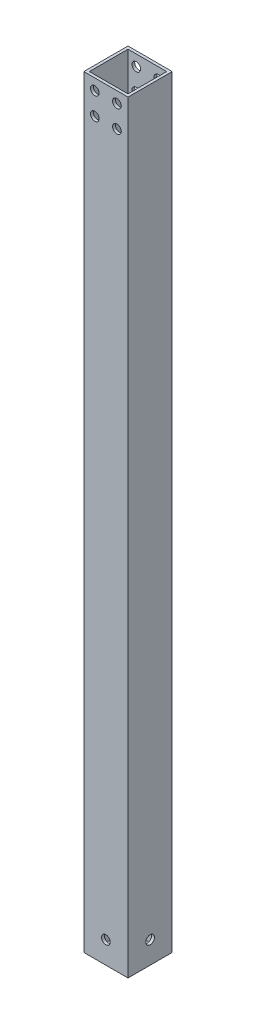
ISO-10303-21;
HEADER;
FILE_DESCRIPTION(('STEP AP214'),'2;1');
FILE_NAME('part.step','',(''),(''),'','','');
FILE_SCHEMA(('AUTOMOTIVE_DESIGN { 1 0 10303 214 1 1 1 1 }'));
ENDSEC;
DATA;
#1=APPLICATION_CONTEXT('core data for automotive mechanical design processes');
#2=APPLICATION_PROTOCOL_DEFINITION('international standard','automotive_design',2000,#1);
#3=PRODUCT_CONTEXT('',#1,'mechanical');
#4=PRODUCT('Part','Part','',(#3));
#5=PRODUCT_RELATED_PRODUCT_CATEGORY('part','',(#4));
#6=PRODUCT_DEFINITION_FORMATION('','',#4);
#7=PRODUCT_DEFINITION_CONTEXT('part definition',#1,'design');
#8=PRODUCT_DEFINITION('design','',#6,#7);
#9=PRODUCT_DEFINITION_SHAPE('','',#8);
#10=(LENGTH_UNIT() NAMED_UNIT(*) SI_UNIT(.MILLI.,.METRE.));
#11=(NAMED_UNIT(*) PLANE_ANGLE_UNIT() SI_UNIT($,.RADIAN.));
#12=(NAMED_UNIT(*) SI_UNIT($,.STERADIAN.) SOLID_ANGLE_UNIT());
#13=UNCERTAINTY_MEASURE_WITH_UNIT(LENGTH_MEASURE(1.E-05),#10,'distance_accuracy_value','');
#14=(GEOMETRIC_REPRESENTATION_CONTEXT(3) GLOBAL_UNCERTAINTY_ASSIGNED_CONTEXT((#13)) GLOBAL_UNIT_ASSIGNED_CONTEXT((#10,
#11,#12)) REPRESENTATION_CONTEXT('',''));
#15=CARTESIAN_POINT('',(0.,0.,0.));
#16=DIRECTION('',(0.,0.,1.));
#17=DIRECTION('',(1.,0.,0.));
#18=AXIS2_PLACEMENT_3D('',#15,#16,#17);
#19=CARTESIAN_POINT('',(12.7,955.562720587149,25.4));
#20=DIRECTION('',(0.,1.,0.));
#21=DIRECTION('',(0.,0.,-1.));
#22=AXIS2_PLACEMENT_3D('',#19,#20,#21);
#23=PLANE('',#22);
#24=DIRECTION('',(-1.,0.,0.));
#25=VECTOR('',#24,1.);
#26=CARTESIAN_POINT('',(12.7,955.562720587149,0.));
#27=LINE('',#26,#25);
#28=CARTESIAN_POINT('',(38.1000000000002,955.562720587149,0.));
#29=VERTEX_POINT('',#28);
#30=CARTESIAN_POINT('',(12.7,955.562720587149,0.));
#31=VERTEX_POINT('',#30);
#32=EDGE_CURVE('E148',#29,#31,#27,.T.);
#33=ORIENTED_EDGE('',*,*,#32,.T.);
#34=DIRECTION('',(0.,0.,-1.));
#35=VECTOR('',#34,1.);
#36=CARTESIAN_POINT('',(12.7,955.562720587149,25.4));
#37=LINE('',#36,#35);
#38=CARTESIAN_POINT('',(12.7,955.562720587149,25.4));
#39=VERTEX_POINT('',#38);
#40=EDGE_CURVE('E11',#39,#31,#37,.T.);
#41=ORIENTED_EDGE('',*,*,#40,.F.);
#42=DIRECTION('',(-1.,0.,0.));
#43=VECTOR('',#42,1.);
#44=CARTESIAN_POINT('',(12.7,955.562720587149,25.4));
#45=LINE('',#44,#43);
#46=CARTESIAN_POINT('',(38.1000000000002,955.562720587149,25.4));
#47=VERTEX_POINT('',#46);
#48=EDGE_CURVE('E153',#47,#39,#45,.T.);
#49=ORIENTED_EDGE('',*,*,#48,.F.);
#50=DIRECTION('',(0.,0.,-1.));
#51=VECTOR('',#50,1.);
#52=CARTESIAN_POINT('',(38.1000000000002,955.562720587149,25.4));
#53=LINE('',#52,#51);
#54=EDGE_CURVE('E48',#47,#29,#53,.T.);
#55=ORIENTED_EDGE('',*,*,#54,.T.);
#56=EDGE_LOOP('',(#33,#41,#49,#55));
#57=FACE_BOUND('',#56,.T.);
#58=DIRECTION('',(0.,0.,-1.));
#59=VECTOR('',#58,1.);
#60=CARTESIAN_POINT('',(36.5125000000002,955.562720587149,25.4));
#61=LINE('',#60,#59);
#62=CARTESIAN_POINT('',(36.5125000000002,955.562720587149,23.8125));
#63=VERTEX_POINT('',#62);
#64=CARTESIAN_POINT('',(36.5125000000002,955.562720587149,1.5875));
#65=VERTEX_POINT('',#64);
#66=EDGE_CURVE('E128',#63,#65,#61,.T.);
#67=ORIENTED_EDGE('',*,*,#66,.F.);
#68=DIRECTION('',(-1.,0.,0.));
#69=VECTOR('',#68,1.);
#70=CARTESIAN_POINT('',(0.,955.562720587149,23.8125));
#71=LINE('',#70,#69);
#72=CARTESIAN_POINT('',(14.2875,955.562720587149,23.8125));
#73=VERTEX_POINT('',#72);
#74=EDGE_CURVE('E126',#63,#73,#71,.T.);
#75=ORIENTED_EDGE('',*,*,#74,.T.);
#76=DIRECTION('',(0.,0.,-1.));
#77=VECTOR('',#76,1.);
#78=CARTESIAN_POINT('',(14.2875,955.562720587149,25.4));
#79=LINE('',#78,#77);
#80=CARTESIAN_POINT('',(14.2875,955.562720587149,1.5875));
#81=VERTEX_POINT('',#80);
#82=EDGE_CURVE('E108',#73,#81,#79,.T.);
#83=ORIENTED_EDGE('',*,*,#82,.T.);
#84=DIRECTION('',(-1.,0.,0.));
#85=VECTOR('',#84,1.);
#86=CARTESIAN_POINT('',(0.,955.562720587149,1.5875));
#87=LINE('',#86,#85);
#88=EDGE_CURVE('E119',#65,#81,#87,.T.);
#89=ORIENTED_EDGE('',*,*,#88,.F.);
#90=EDGE_LOOP('',(#67,#75,#83,#89));
#91=FACE_BOUND('',#90,.T.);
#92=ADVANCED_FACE('F39',(#57,#91),#23,.T.);
#93=CARTESIAN_POINT('',(12.7,517.412720587149,25.4));
#94=DIRECTION('',(0.,-1.,0.));
#95=DIRECTION('',(0.,0.,1.));
#96=AXIS2_PLACEMENT_3D('',#93,#94,#95);
#97=PLANE('',#96);
#98=DIRECTION('',(1.,0.,0.));
#99=VECTOR('',#98,1.);
#100=CARTESIAN_POINT('',(12.7,517.412720587149,0.));
#101=LINE('',#100,#99);
#102=CARTESIAN_POINT('',(12.7,517.412720587149,0.));
#103=VERTEX_POINT('',#102);
#104=CARTESIAN_POINT('',(38.1000000000003,517.412720587149,0.));
#105=VERTEX_POINT('',#104);
#106=EDGE_CURVE('E130',#103,#105,#101,.T.);
#107=ORIENTED_EDGE('',*,*,#106,.T.);
#108=DIRECTION('',(0.,0.,-1.));
#109=VECTOR('',#108,1.);
#110=CARTESIAN_POINT('',(38.1000000000003,517.412720587149,25.4));
#111=LINE('',#110,#109);
#112=CARTESIAN_POINT('',(38.1000000000003,517.412720587149,25.4));
#113=VERTEX_POINT('',#112);
#114=EDGE_CURVE('E165',#113,#105,#111,.T.);
#115=ORIENTED_EDGE('',*,*,#114,.F.);
#116=DIRECTION('',(1.,0.,0.));
#117=VECTOR('',#116,1.);
#118=CARTESIAN_POINT('',(12.7,517.412720587149,25.4));
#119=LINE('',#118,#117);
#120=CARTESIAN_POINT('',(12.7,517.412720587149,25.4));
#121=VERTEX_POINT('',#120);
#122=EDGE_CURVE('E147',#121,#113,#119,.T.);
#123=ORIENTED_EDGE('',*,*,#122,.F.);
#124=DIRECTION('',(0.,0.,-1.));
#125=VECTOR('',#124,1.);
#126=CARTESIAN_POINT('',(12.7,517.412720587149,25.4));
#127=LINE('',#126,#125);
#128=EDGE_CURVE('E155',#121,#103,#127,.T.);
#129=ORIENTED_EDGE('',*,*,#128,.T.);
#130=EDGE_LOOP('',(#107,#115,#123,#129));
#131=FACE_BOUND('',#130,.T.);
#132=DIRECTION('',(0.,0.,-1.));
#133=VECTOR('',#132,1.);
#134=CARTESIAN_POINT('',(14.2875,517.412720587149,25.4));
#135=LINE('',#134,#133);
#136=CARTESIAN_POINT('',(14.2875,517.412720587149,23.8125));
#137=VERTEX_POINT('',#136);
#138=CARTESIAN_POINT('',(14.2875,517.412720587149,1.5875));
#139=VERTEX_POINT('',#138);
#140=EDGE_CURVE('E111',#137,#139,#135,.T.);
#141=ORIENTED_EDGE('',*,*,#140,.F.);
#142=DIRECTION('',(1.,0.,0.));
#143=VECTOR('',#142,1.);
#144=CARTESIAN_POINT('',(0.,517.412720587149,23.8125));
#145=LINE('',#144,#143);
#146=CARTESIAN_POINT('',(36.5125000000003,517.412720587149,23.8125));
#147=VERTEX_POINT('',#146);
#148=EDGE_CURVE('E139',#137,#147,#145,.T.);
#149=ORIENTED_EDGE('',*,*,#148,.T.);
#150=DIRECTION('',(0.,0.,-1.));
#151=VECTOR('',#150,1.);
#152=CARTESIAN_POINT('',(36.5125000000003,517.412720587149,25.4));
#153=LINE('',#152,#151);
#154=CARTESIAN_POINT('',(36.5125000000003,517.412720587149,1.5875));
#155=VERTEX_POINT('',#154);
#156=EDGE_CURVE('E132',#147,#155,#153,.T.);
#157=ORIENTED_EDGE('',*,*,#156,.T.);
#158=DIRECTION('',(1.,0.,0.));
#159=VECTOR('',#158,1.);
#160=CARTESIAN_POINT('',(0.,517.412720587149,1.5875));
#161=LINE('',#160,#159);
#162=EDGE_CURVE('E115',#139,#155,#161,.T.);
#163=ORIENTED_EDGE('',*,*,#162,.F.);
#164=EDGE_LOOP('',(#141,#149,#157,#163));
#165=FACE_BOUND('',#164,.T.);
#166=ADVANCED_FACE('F215',(#131,#165),#97,.T.);
#167=CARTESIAN_POINT('',(12.7,955.562720587149,25.4));
#168=DIRECTION('',(-1.,0.,0.));
#169=DIRECTION('',(0.,-1.,0.));
#170=AXIS2_PLACEMENT_3D('',#167,#168,#169);
#171=PLANE('',#170);
#172=CARTESIAN_POINT('',(12.7000000000002,530.112720587149,12.7));
#173=DIRECTION('',(-1.,0.,0.));
#174=DIRECTION('',(0.,1.,0.));
#175=AXIS2_PLACEMENT_3D('',#172,#173,#174);
#176=CIRCLE('',#175,2.4892);
#177=CARTESIAN_POINT('',(12.7000000000002,532.601920587149,12.7));
#178=VERTEX_POINT('',#177);
#179=EDGE_CURVE('E354',#178,#178,#176,.T.);
#180=ORIENTED_EDGE('',*,*,#179,.F.);
#181=EDGE_LOOP('',(#180));
#182=FACE_BOUND('',#181,.T.);
#183=DIRECTION('',(0.,-1.,0.));
#184=VECTOR('',#183,1.);
#185=CARTESIAN_POINT('',(12.7,955.562720587149,0.));
#186=LINE('',#185,#184);
#187=EDGE_CURVE('E127',#31,#103,#186,.T.);
#188=ORIENTED_EDGE('',*,*,#187,.T.);
#189=ORIENTED_EDGE('',*,*,#128,.F.);
#190=DIRECTION('',(0.,-1.,0.));
#191=VECTOR('',#190,1.);
#192=CARTESIAN_POINT('',(12.7,955.562720587149,25.4));
#193=LINE('',#192,#191);
#194=EDGE_CURVE('E145',#39,#121,#193,.T.);
#195=ORIENTED_EDGE('',*,*,#194,.F.);
#196=ORIENTED_EDGE('',*,*,#40,.T.);
#197=EDGE_LOOP('',(#188,#189,#195,#196));
#198=FACE_BOUND('',#197,.T.);
#199=ADVANCED_FACE('F41',(#182,#198),#171,.T.);
#200=CARTESIAN_POINT('',(38.1000000000002,955.562720587149,25.4));
#201=DIRECTION('',(1.,0.,0.));
#202=DIRECTION('',(0.,1.,0.));
#203=AXIS2_PLACEMENT_3D('',#200,#201,#202);
#204=PLANE('',#203);
#205=CARTESIAN_POINT('',(38.1000000000002,530.112720587149,12.7));
#206=DIRECTION('',(-1.,0.,0.));
#207=DIRECTION('',(0.,1.,0.));
#208=AXIS2_PLACEMENT_3D('',#205,#206,#207);
#209=CIRCLE('',#208,2.4892);
#210=CARTESIAN_POINT('',(38.1000000000002,532.601920587149,12.7));
#211=VERTEX_POINT('',#210);
#212=EDGE_CURVE('E239',#211,#211,#209,.T.);
#213=ORIENTED_EDGE('',*,*,#212,.T.);
#214=EDGE_LOOP('',(#213));
#215=FACE_BOUND('',#214,.T.);
#216=DIRECTION('',(0.,1.,0.));
#217=VECTOR('',#216,1.);
#218=CARTESIAN_POINT('',(38.1000000000002,955.562720587149,0.));
#219=LINE('',#218,#217);
#220=EDGE_CURVE('E159',#105,#29,#219,.T.);
#221=ORIENTED_EDGE('',*,*,#220,.T.);
#222=ORIENTED_EDGE('',*,*,#54,.F.);
#223=DIRECTION('',(0.,1.,0.));
#224=VECTOR('',#223,1.);
#225=CARTESIAN_POINT('',(38.1000000000002,955.562720587149,25.4));
#226=LINE('',#225,#224);
#227=EDGE_CURVE('E151',#113,#47,#226,.T.);
#228=ORIENTED_EDGE('',*,*,#227,.F.);
#229=ORIENTED_EDGE('',*,*,#114,.T.);
#230=EDGE_LOOP('',(#221,#222,#228,#229));
#231=FACE_BOUND('',#230,.T.);
#232=ADVANCED_FACE('F226',(#215,#231),#204,.T.);
#233=CARTESIAN_POINT('',(0.,0.,25.4));
#234=DIRECTION('',(0.,0.,-1.));
#235=DIRECTION('',(1.,0.,0.));
#236=AXIS2_PLACEMENT_3D('',#233,#234,#235);
#237=PLANE('',#236);
#238=CARTESIAN_POINT('',(25.4000000000001,530.112720587149,25.4));
#239=DIRECTION('',(0.,0.,1.));
#240=DIRECTION('',(1.,0.,0.));
#241=AXIS2_PLACEMENT_3D('',#238,#239,#240);
#242=CIRCLE('',#241,2.48919999999996);
#243=CARTESIAN_POINT('',(27.8892,530.112720587149,25.4));
#244=VERTEX_POINT('',#243);
#245=EDGE_CURVE('E174',#244,#244,#242,.T.);
#246=ORIENTED_EDGE('',*,*,#245,.F.);
#247=EDGE_LOOP('',(#246));
#248=FACE_BOUND('',#247,.T.);
#249=CARTESIAN_POINT('',(31.7500000000001,949.212720587149,25.4));
#250=DIRECTION('',(0.,0.,1.));
#251=DIRECTION('',(1.,0.,0.));
#252=AXIS2_PLACEMENT_3D('',#249,#250,#251);
#253=CIRCLE('',#252,2.48919999999991);
#254=CARTESIAN_POINT('',(34.2392,949.212720587149,25.4));
#255=VERTEX_POINT('',#254);
#256=EDGE_CURVE('E366',#255,#255,#253,.T.);
#257=ORIENTED_EDGE('',*,*,#256,.F.);
#258=EDGE_LOOP('',(#257));
#259=FACE_BOUND('',#258,.T.);
#260=CARTESIAN_POINT('',(19.0500000000001,949.212720587149,25.4));
#261=DIRECTION('',(0.,0.,1.));
#262=DIRECTION('',(1.,0.,0.));
#263=AXIS2_PLACEMENT_3D('',#260,#261,#262);
#264=CIRCLE('',#263,2.48919999999989);
#265=CARTESIAN_POINT('',(21.5392,949.212720587149,25.4));
#266=VERTEX_POINT('',#265);
#267=EDGE_CURVE('E370',#266,#266,#264,.T.);
#268=ORIENTED_EDGE('',*,*,#267,.F.);
#269=EDGE_LOOP('',(#268));
#270=FACE_BOUND('',#269,.T.);
#271=CARTESIAN_POINT('',(19.0500000000001,936.512720587149,25.4));
#272=DIRECTION('',(0.,0.,1.));
#273=DIRECTION('',(1.,0.,0.));
#274=AXIS2_PLACEMENT_3D('',#271,#272,#273);
#275=CIRCLE('',#274,2.48919999999989);
#276=CARTESIAN_POINT('',(21.5392,936.512720587149,25.4));
#277=VERTEX_POINT('',#276);
#278=EDGE_CURVE('E279',#277,#277,#275,.T.);
#279=ORIENTED_EDGE('',*,*,#278,.F.);
#280=EDGE_LOOP('',(#279));
#281=FACE_BOUND('',#280,.T.);
#282=CARTESIAN_POINT('',(31.7500000000001,936.512720587149,25.4));
#283=DIRECTION('',(0.,0.,1.));
#284=DIRECTION('',(1.,0.,0.));
#285=AXIS2_PLACEMENT_3D('',#282,#283,#284);
#286=CIRCLE('',#285,2.48919999999991);
#287=CARTESIAN_POINT('',(34.2392,936.512720587149,25.4));
#288=VERTEX_POINT('',#287);
#289=EDGE_CURVE('E280',#288,#288,#286,.T.);
#290=ORIENTED_EDGE('',*,*,#289,.F.);
#291=EDGE_LOOP('',(#290));
#292=FACE_BOUND('',#291,.T.);
#293=ORIENTED_EDGE('',*,*,#194,.T.);
#294=ORIENTED_EDGE('',*,*,#122,.T.);
#295=ORIENTED_EDGE('',*,*,#227,.T.);
#296=ORIENTED_EDGE('',*,*,#48,.T.);
#297=EDGE_LOOP('',(#293,#294,#295,#296));
#298=FACE_BOUND('',#297,.T.);
#299=ADVANCED_FACE('F228',(#248,#259,#270,#281,#292,#298),#237,.F.);
#300=CARTESIAN_POINT('',(0.,0.,0.));
#301=DIRECTION('',(0.,0.,-1.));
#302=DIRECTION('',(1.,0.,0.));
#303=AXIS2_PLACEMENT_3D('',#300,#301,#302);
#304=PLANE('',#303);
#305=CARTESIAN_POINT('',(25.4000000000001,530.112720587149,0.));
#306=DIRECTION('',(0.,0.,1.));
#307=DIRECTION('',(1.,0.,0.));
#308=AXIS2_PLACEMENT_3D('',#305,#306,#307);
#309=CIRCLE('',#308,2.48919999999996);
#310=CARTESIAN_POINT('',(27.8892,530.112720587149,0.));
#311=VERTEX_POINT('',#310);
#312=EDGE_CURVE('E262',#311,#311,#309,.T.);
#313=ORIENTED_EDGE('',*,*,#312,.T.);
#314=EDGE_LOOP('',(#313));
#315=FACE_BOUND('',#314,.T.);
#316=CARTESIAN_POINT('',(31.7500000000001,949.212720587149,0.));
#317=DIRECTION('',(0.,0.,1.));
#318=DIRECTION('',(1.,0.,0.));
#319=AXIS2_PLACEMENT_3D('',#316,#317,#318);
#320=CIRCLE('',#319,2.48919999999991);
#321=CARTESIAN_POINT('',(34.2392,949.212720587149,0.));
#322=VERTEX_POINT('',#321);
#323=EDGE_CURVE('E266',#322,#322,#320,.T.);
#324=ORIENTED_EDGE('',*,*,#323,.T.);
#325=EDGE_LOOP('',(#324));
#326=FACE_BOUND('',#325,.T.);
#327=CARTESIAN_POINT('',(19.0500000000001,949.212720587149,0.));
#328=DIRECTION('',(0.,0.,1.));
#329=DIRECTION('',(1.,0.,0.));
#330=AXIS2_PLACEMENT_3D('',#327,#328,#329);
#331=CIRCLE('',#330,2.48919999999989);
#332=CARTESIAN_POINT('',(21.5392,949.212720587149,0.));
#333=VERTEX_POINT('',#332);
#334=EDGE_CURVE('E270',#333,#333,#331,.T.);
#335=ORIENTED_EDGE('',*,*,#334,.T.);
#336=EDGE_LOOP('',(#335));
#337=FACE_BOUND('',#336,.T.);
#338=CARTESIAN_POINT('',(19.0500000000001,936.512720587149,0.));
#339=DIRECTION('',(0.,0.,1.));
#340=DIRECTION('',(1.,0.,0.));
#341=AXIS2_PLACEMENT_3D('',#338,#339,#340);
#342=CIRCLE('',#341,2.48919999999989);
#343=CARTESIAN_POINT('',(21.5392,936.512720587149,0.));
#344=VERTEX_POINT('',#343);
#345=EDGE_CURVE('E274',#344,#344,#342,.T.);
#346=ORIENTED_EDGE('',*,*,#345,.T.);
#347=EDGE_LOOP('',(#346));
#348=FACE_BOUND('',#347,.T.);
#349=CARTESIAN_POINT('',(31.7500000000001,936.512720587149,0.));
#350=DIRECTION('',(0.,0.,1.));
#351=DIRECTION('',(1.,0.,0.));
#352=AXIS2_PLACEMENT_3D('',#349,#350,#351);
#353=CIRCLE('',#352,2.48919999999991);
#354=CARTESIAN_POINT('',(34.2392,936.512720587149,0.));
#355=VERTEX_POINT('',#354);
#356=EDGE_CURVE('E277',#355,#355,#353,.T.);
#357=ORIENTED_EDGE('',*,*,#356,.T.);
#358=EDGE_LOOP('',(#357));
#359=FACE_BOUND('',#358,.T.);
#360=ORIENTED_EDGE('',*,*,#187,.F.);
#361=ORIENTED_EDGE('',*,*,#32,.F.);
#362=ORIENTED_EDGE('',*,*,#220,.F.);
#363=ORIENTED_EDGE('',*,*,#106,.F.);
#364=EDGE_LOOP('',(#360,#361,#362,#363));
#365=FACE_BOUND('',#364,.T.);
#366=ADVANCED_FACE('F224',(#315,#326,#337,#348,#359,#365),#304,.T.);
#367=CARTESIAN_POINT('',(14.2875,955.562720587149,25.4));
#368=DIRECTION('',(-1.,0.,0.));
#369=DIRECTION('',(0.,-1.,0.));
#370=AXIS2_PLACEMENT_3D('',#367,#368,#369);
#371=PLANE('',#370);
#372=CARTESIAN_POINT('',(14.2875,530.112720587149,12.7));
#373=DIRECTION('',(1.,0.,0.));
#374=DIRECTION('',(0.,-1.,0.));
#375=AXIS2_PLACEMENT_3D('',#372,#373,#374);
#376=CIRCLE('',#375,2.4892);
#377=CARTESIAN_POINT('',(14.2875,527.623520587149,12.7));
#378=VERTEX_POINT('',#377);
#379=EDGE_CURVE('E285',#378,#378,#376,.T.);
#380=ORIENTED_EDGE('',*,*,#379,.F.);
#381=EDGE_LOOP('',(#380));
#382=FACE_BOUND('',#381,.T.);
#383=DIRECTION('',(0.,-1.,0.));
#384=VECTOR('',#383,1.);
#385=CARTESIAN_POINT('',(14.2875,0.,1.5875));
#386=LINE('',#385,#384);
#387=EDGE_CURVE('E104',#81,#139,#386,.T.);
#388=ORIENTED_EDGE('',*,*,#387,.F.);
#389=ORIENTED_EDGE('',*,*,#82,.F.);
#390=DIRECTION('',(0.,-1.,0.));
#391=VECTOR('',#390,1.);
#392=CARTESIAN_POINT('',(14.2875,0.,23.8125));
#393=LINE('',#392,#391);
#394=EDGE_CURVE('E56',#73,#137,#393,.T.);
#395=ORIENTED_EDGE('',*,*,#394,.T.);
#396=ORIENTED_EDGE('',*,*,#140,.T.);
#397=EDGE_LOOP('',(#388,#389,#395,#396));
#398=FACE_BOUND('',#397,.T.);
#399=ADVANCED_FACE('F106',(#382,#398),#371,.F.);
#400=CARTESIAN_POINT('',(36.5125000000002,955.562720587149,25.4));
#401=DIRECTION('',(1.,0.,0.));
#402=DIRECTION('',(0.,1.,0.));
#403=AXIS2_PLACEMENT_3D('',#400,#401,#402);
#404=PLANE('',#403);
#405=CARTESIAN_POINT('',(36.5125000000003,530.112720587149,12.7));
#406=DIRECTION('',(-1.,0.,0.));
#407=DIRECTION('',(0.,1.,0.));
#408=AXIS2_PLACEMENT_3D('',#405,#406,#407);
#409=CIRCLE('',#408,2.4892);
#410=CARTESIAN_POINT('',(36.5125000000003,532.601920587149,12.7));
#411=VERTEX_POINT('',#410);
#412=EDGE_CURVE('E43',#411,#411,#409,.T.);
#413=ORIENTED_EDGE('',*,*,#412,.F.);
#414=EDGE_LOOP('',(#413));
#415=FACE_BOUND('',#414,.T.);
#416=DIRECTION('',(0.,1.,0.));
#417=VECTOR('',#416,1.);
#418=CARTESIAN_POINT('',(36.5125000000004,0.,1.5875));
#419=LINE('',#418,#417);
#420=EDGE_CURVE('E121',#155,#65,#419,.T.);
#421=ORIENTED_EDGE('',*,*,#420,.F.);
#422=ORIENTED_EDGE('',*,*,#156,.F.);
#423=DIRECTION('',(0.,1.,0.));
#424=VECTOR('',#423,1.);
#425=CARTESIAN_POINT('',(36.5125000000004,0.,23.8125));
#426=LINE('',#425,#424);
#427=EDGE_CURVE('E61',#147,#63,#426,.T.);
#428=ORIENTED_EDGE('',*,*,#427,.T.);
#429=ORIENTED_EDGE('',*,*,#66,.T.);
#430=EDGE_LOOP('',(#421,#422,#428,#429));
#431=FACE_BOUND('',#430,.T.);
#432=ADVANCED_FACE('F200',(#415,#431),#404,.F.);
#433=CARTESIAN_POINT('',(0.,0.,23.8125));
#434=DIRECTION('',(0.,0.,-1.));
#435=DIRECTION('',(1.,0.,0.));
#436=AXIS2_PLACEMENT_3D('',#433,#434,#435);
#437=PLANE('',#436);
#438=CARTESIAN_POINT('',(25.4000000000001,530.112720587149,23.8125));
#439=DIRECTION('',(0.,0.,1.));
#440=DIRECTION('',(1.,0.,0.));
#441=AXIS2_PLACEMENT_3D('',#438,#439,#440);
#442=CIRCLE('',#441,2.48919999999996);
#443=CARTESIAN_POINT('',(27.8892,530.112720587149,23.8125));
#444=VERTEX_POINT('',#443);
#445=EDGE_CURVE('E116',#444,#444,#442,.T.);
#446=ORIENTED_EDGE('',*,*,#445,.T.);
#447=EDGE_LOOP('',(#446));
#448=FACE_BOUND('',#447,.T.);
#449=CARTESIAN_POINT('',(31.7500000000001,949.212720587149,23.8125));
#450=DIRECTION('',(0.,0.,1.));
#451=DIRECTION('',(1.,0.,0.));
#452=AXIS2_PLACEMENT_3D('',#449,#450,#451);
#453=CIRCLE('',#452,2.48919999999991);
#454=CARTESIAN_POINT('',(34.2392,949.212720587149,23.8125));
#455=VERTEX_POINT('',#454);
#456=EDGE_CURVE('E185',#455,#455,#453,.T.);
#457=ORIENTED_EDGE('',*,*,#456,.T.);
#458=EDGE_LOOP('',(#457));
#459=FACE_BOUND('',#458,.T.);
#460=CARTESIAN_POINT('',(19.0500000000001,949.212720587149,23.8125));
#461=DIRECTION('',(0.,0.,1.));
#462=DIRECTION('',(1.,0.,0.));
#463=AXIS2_PLACEMENT_3D('',#460,#461,#462);
#464=CIRCLE('',#463,2.48919999999989);
#465=CARTESIAN_POINT('',(21.5392,949.212720587149,23.8125));
#466=VERTEX_POINT('',#465);
#467=EDGE_CURVE('E182',#466,#466,#464,.T.);
#468=ORIENTED_EDGE('',*,*,#467,.T.);
#469=EDGE_LOOP('',(#468));
#470=FACE_BOUND('',#469,.T.);
#471=CARTESIAN_POINT('',(19.0500000000001,936.512720587149,23.8125));
#472=DIRECTION('',(0.,0.,1.));
#473=DIRECTION('',(1.,0.,0.));
#474=AXIS2_PLACEMENT_3D('',#471,#472,#473);
#475=CIRCLE('',#474,2.48919999999989);
#476=CARTESIAN_POINT('',(21.5392,936.512720587149,23.8125));
#477=VERTEX_POINT('',#476);
#478=EDGE_CURVE('E178',#477,#477,#475,.T.);
#479=ORIENTED_EDGE('',*,*,#478,.T.);
#480=EDGE_LOOP('',(#479));
#481=FACE_BOUND('',#480,.T.);
#482=CARTESIAN_POINT('',(31.7500000000001,936.512720587149,23.8125));
#483=DIRECTION('',(0.,0.,1.));
#484=DIRECTION('',(1.,0.,0.));
#485=AXIS2_PLACEMENT_3D('',#482,#483,#484);
#486=CIRCLE('',#485,2.48919999999991);
#487=CARTESIAN_POINT('',(34.2392,936.512720587149,23.8125));
#488=VERTEX_POINT('',#487);
#489=EDGE_CURVE('E173',#488,#488,#486,.T.);
#490=ORIENTED_EDGE('',*,*,#489,.T.);
#491=EDGE_LOOP('',(#490));
#492=FACE_BOUND('',#491,.T.);
#493=ORIENTED_EDGE('',*,*,#394,.F.);
#494=ORIENTED_EDGE('',*,*,#74,.F.);
#495=ORIENTED_EDGE('',*,*,#427,.F.);
#496=ORIENTED_EDGE('',*,*,#148,.F.);
#497=EDGE_LOOP('',(#493,#494,#495,#496));
#498=FACE_BOUND('',#497,.T.);
#499=ADVANCED_FACE('F201',(#448,#459,#470,#481,#492,#498),#437,.T.);
#500=CARTESIAN_POINT('',(0.,0.,1.5875));
#501=DIRECTION('',(0.,0.,-1.));
#502=DIRECTION('',(1.,0.,0.));
#503=AXIS2_PLACEMENT_3D('',#500,#501,#502);
#504=PLANE('',#503);
#505=CARTESIAN_POINT('',(25.4000000000001,530.112720587149,1.5875));
#506=DIRECTION('',(0.,0.,1.));
#507=DIRECTION('',(1.,0.,0.));
#508=AXIS2_PLACEMENT_3D('',#505,#506,#507);
#509=CIRCLE('',#508,2.48919999999996);
#510=CARTESIAN_POINT('',(27.8892,530.112720587149,1.5875));
#511=VERTEX_POINT('',#510);
#512=EDGE_CURVE('E186',#511,#511,#509,.T.);
#513=ORIENTED_EDGE('',*,*,#512,.F.);
#514=EDGE_LOOP('',(#513));
#515=FACE_BOUND('',#514,.T.);
#516=CARTESIAN_POINT('',(31.7500000000001,949.212720587149,1.5875));
#517=DIRECTION('',(0.,0.,1.));
#518=DIRECTION('',(1.,0.,0.));
#519=AXIS2_PLACEMENT_3D('',#516,#517,#518);
#520=CIRCLE('',#519,2.48919999999991);
#521=CARTESIAN_POINT('',(34.2392,949.212720587149,1.5875));
#522=VERTEX_POINT('',#521);
#523=EDGE_CURVE('E183',#522,#522,#520,.T.);
#524=ORIENTED_EDGE('',*,*,#523,.F.);
#525=EDGE_LOOP('',(#524));
#526=FACE_BOUND('',#525,.T.);
#527=CARTESIAN_POINT('',(19.0500000000001,949.212720587149,1.5875));
#528=DIRECTION('',(0.,0.,1.));
#529=DIRECTION('',(1.,0.,0.));
#530=AXIS2_PLACEMENT_3D('',#527,#528,#529);
#531=CIRCLE('',#530,2.48919999999989);
#532=CARTESIAN_POINT('',(21.5392,949.212720587149,1.5875));
#533=VERTEX_POINT('',#532);
#534=EDGE_CURVE('E179',#533,#533,#531,.T.);
#535=ORIENTED_EDGE('',*,*,#534,.F.);
#536=EDGE_LOOP('',(#535));
#537=FACE_BOUND('',#536,.T.);
#538=CARTESIAN_POINT('',(19.0500000000001,936.512720587149,1.5875));
#539=DIRECTION('',(0.,0.,1.));
#540=DIRECTION('',(1.,0.,0.));
#541=AXIS2_PLACEMENT_3D('',#538,#539,#540);
#542=CIRCLE('',#541,2.48919999999989);
#543=CARTESIAN_POINT('',(21.5392,936.512720587149,1.5875));
#544=VERTEX_POINT('',#543);
#545=EDGE_CURVE('E175',#544,#544,#542,.T.);
#546=ORIENTED_EDGE('',*,*,#545,.F.);
#547=EDGE_LOOP('',(#546));
#548=FACE_BOUND('',#547,.T.);
#549=CARTESIAN_POINT('',(31.7500000000001,936.512720587149,1.5875));
#550=DIRECTION('',(0.,0.,1.));
#551=DIRECTION('',(1.,0.,0.));
#552=AXIS2_PLACEMENT_3D('',#549,#550,#551);
#553=CIRCLE('',#552,2.48919999999991);
#554=CARTESIAN_POINT('',(34.2392,936.512720587149,1.5875));
#555=VERTEX_POINT('',#554);
#556=EDGE_CURVE('E170',#555,#555,#553,.T.);
#557=ORIENTED_EDGE('',*,*,#556,.F.);
#558=EDGE_LOOP('',(#557));
#559=FACE_BOUND('',#558,.T.);
#560=ORIENTED_EDGE('',*,*,#387,.T.);
#561=ORIENTED_EDGE('',*,*,#162,.T.);
#562=ORIENTED_EDGE('',*,*,#420,.T.);
#563=ORIENTED_EDGE('',*,*,#88,.T.);
#564=EDGE_LOOP('',(#560,#561,#562,#563));
#565=FACE_BOUND('',#564,.T.);
#566=ADVANCED_FACE('F120',(#515,#526,#537,#548,#559,#565),#504,.F.);
#567=CARTESIAN_POINT('',(31.7500000000001,936.512720587149,25.4));
#568=DIRECTION('',(0.,0.,-1.));
#569=DIRECTION('',(1.,0.,0.));
#570=AXIS2_PLACEMENT_3D('',#567,#568,#569);
#571=CYLINDRICAL_SURFACE('',#570,2.48919999999991);
#572=ORIENTED_EDGE('',*,*,#356,.F.);
#573=EDGE_LOOP('',(#572));
#574=FACE_BOUND('',#573,.T.);
#575=ORIENTED_EDGE('',*,*,#556,.T.);
#576=EDGE_LOOP('',(#575));
#577=FACE_BOUND('',#576,.T.);
#578=ADVANCED_FACE('F209',(#574,#577),#571,.F.);
#579=CARTESIAN_POINT('',(19.0500000000001,936.512720587149,25.4));
#580=DIRECTION('',(0.,0.,-1.));
#581=DIRECTION('',(1.,0.,0.));
#582=AXIS2_PLACEMENT_3D('',#579,#580,#581);
#583=CYLINDRICAL_SURFACE('',#582,2.48919999999989);
#584=ORIENTED_EDGE('',*,*,#345,.F.);
#585=EDGE_LOOP('',(#584));
#586=FACE_BOUND('',#585,.T.);
#587=ORIENTED_EDGE('',*,*,#545,.T.);
#588=EDGE_LOOP('',(#587));
#589=FACE_BOUND('',#588,.T.);
#590=ADVANCED_FACE('F301',(#586,#589),#583,.F.);
#591=CARTESIAN_POINT('',(19.0500000000001,949.212720587149,25.4));
#592=DIRECTION('',(0.,0.,-1.));
#593=DIRECTION('',(1.,0.,0.));
#594=AXIS2_PLACEMENT_3D('',#591,#592,#593);
#595=CYLINDRICAL_SURFACE('',#594,2.48919999999989);
#596=ORIENTED_EDGE('',*,*,#334,.F.);
#597=EDGE_LOOP('',(#596));
#598=FACE_BOUND('',#597,.T.);
#599=ORIENTED_EDGE('',*,*,#534,.T.);
#600=EDGE_LOOP('',(#599));
#601=FACE_BOUND('',#600,.T.);
#602=ADVANCED_FACE('F323',(#598,#601),#595,.F.);
#603=CARTESIAN_POINT('',(31.7500000000001,949.212720587149,25.4));
#604=DIRECTION('',(0.,0.,-1.));
#605=DIRECTION('',(1.,0.,0.));
#606=AXIS2_PLACEMENT_3D('',#603,#604,#605);
#607=CYLINDRICAL_SURFACE('',#606,2.48919999999991);
#608=ORIENTED_EDGE('',*,*,#323,.F.);
#609=EDGE_LOOP('',(#608));
#610=FACE_BOUND('',#609,.T.);
#611=ORIENTED_EDGE('',*,*,#523,.T.);
#612=EDGE_LOOP('',(#611));
#613=FACE_BOUND('',#612,.T.);
#614=ADVANCED_FACE('F314',(#610,#613),#607,.F.);
#615=CARTESIAN_POINT('',(25.4000000000001,530.112720587149,25.4));
#616=DIRECTION('',(0.,0.,-1.));
#617=DIRECTION('',(1.,0.,0.));
#618=AXIS2_PLACEMENT_3D('',#615,#616,#617);
#619=CYLINDRICAL_SURFACE('',#618,2.48919999999996);
#620=ORIENTED_EDGE('',*,*,#312,.F.);
#621=EDGE_LOOP('',(#620));
#622=FACE_BOUND('',#621,.T.);
#623=ORIENTED_EDGE('',*,*,#512,.T.);
#624=EDGE_LOOP('',(#623));
#625=FACE_BOUND('',#624,.T.);
#626=ADVANCED_FACE('F308',(#622,#625),#619,.F.);
#627=ORIENTED_EDGE('',*,*,#489,.F.);
#628=EDGE_LOOP('',(#627));
#629=FACE_BOUND('',#628,.T.);
#630=ORIENTED_EDGE('',*,*,#289,.T.);
#631=EDGE_LOOP('',(#630));
#632=FACE_BOUND('',#631,.T.);
#633=ADVANCED_FACE('F299',(#629,#632),#571,.F.);
#634=ORIENTED_EDGE('',*,*,#478,.F.);
#635=EDGE_LOOP('',(#634));
#636=FACE_BOUND('',#635,.T.);
#637=ORIENTED_EDGE('',*,*,#278,.T.);
#638=EDGE_LOOP('',(#637));
#639=FACE_BOUND('',#638,.T.);
#640=ADVANCED_FACE('F295',(#636,#639),#583,.F.);
#641=ORIENTED_EDGE('',*,*,#467,.F.);
#642=EDGE_LOOP('',(#641));
#643=FACE_BOUND('',#642,.T.);
#644=ORIENTED_EDGE('',*,*,#267,.T.);
#645=EDGE_LOOP('',(#644));
#646=FACE_BOUND('',#645,.T.);
#647=ADVANCED_FACE('F298',(#643,#646),#595,.F.);
#648=ORIENTED_EDGE('',*,*,#456,.F.);
#649=EDGE_LOOP('',(#648));
#650=FACE_BOUND('',#649,.T.);
#651=ORIENTED_EDGE('',*,*,#256,.T.);
#652=EDGE_LOOP('',(#651));
#653=FACE_BOUND('',#652,.T.);
#654=ADVANCED_FACE('F336',(#650,#653),#607,.F.);
#655=ORIENTED_EDGE('',*,*,#445,.F.);
#656=EDGE_LOOP('',(#655));
#657=FACE_BOUND('',#656,.T.);
#658=ORIENTED_EDGE('',*,*,#245,.T.);
#659=EDGE_LOOP('',(#658));
#660=FACE_BOUND('',#659,.T.);
#661=ADVANCED_FACE('F317',(#657,#660),#619,.F.);
#662=CARTESIAN_POINT('',(12.7000000000002,530.112720587149,12.7));
#663=DIRECTION('',(1.,0.,0.));
#664=DIRECTION('',(0.,1.,0.));
#665=AXIS2_PLACEMENT_3D('',#662,#663,#664);
#666=CYLINDRICAL_SURFACE('',#665,2.4892);
#667=ORIENTED_EDGE('',*,*,#212,.F.);
#668=EDGE_LOOP('',(#667));
#669=FACE_BOUND('',#668,.T.);
#670=ORIENTED_EDGE('',*,*,#412,.T.);
#671=EDGE_LOOP('',(#670));
#672=FACE_BOUND('',#671,.T.);
#673=ADVANCED_FACE('F342',(#669,#672),#666,.F.);
#674=ORIENTED_EDGE('',*,*,#179,.T.);
#675=EDGE_LOOP('',(#674));
#676=FACE_BOUND('',#675,.T.);
#677=ORIENTED_EDGE('',*,*,#379,.T.);
#678=EDGE_LOOP('',(#677));
#679=FACE_BOUND('',#678,.T.);
#680=ADVANCED_FACE('F344',(#676,#679),#666,.F.);
#681=CLOSED_SHELL('',(#92,#166,#199,#232,#299,#366,#399,#432,#499,#566,#578,#590,#602,#614,#626,
#633,#640,#647,#654,#661,#673,#680));
#682=MANIFOLD_SOLID_BREP('B2',#681);
#683=ADVANCED_BREP_SHAPE_REPRESENTATION('',(#18,#682),#14);
#684=SHAPE_DEFINITION_REPRESENTATION(#9,#683);
ENDSEC;
END-ISO-10303-21;
